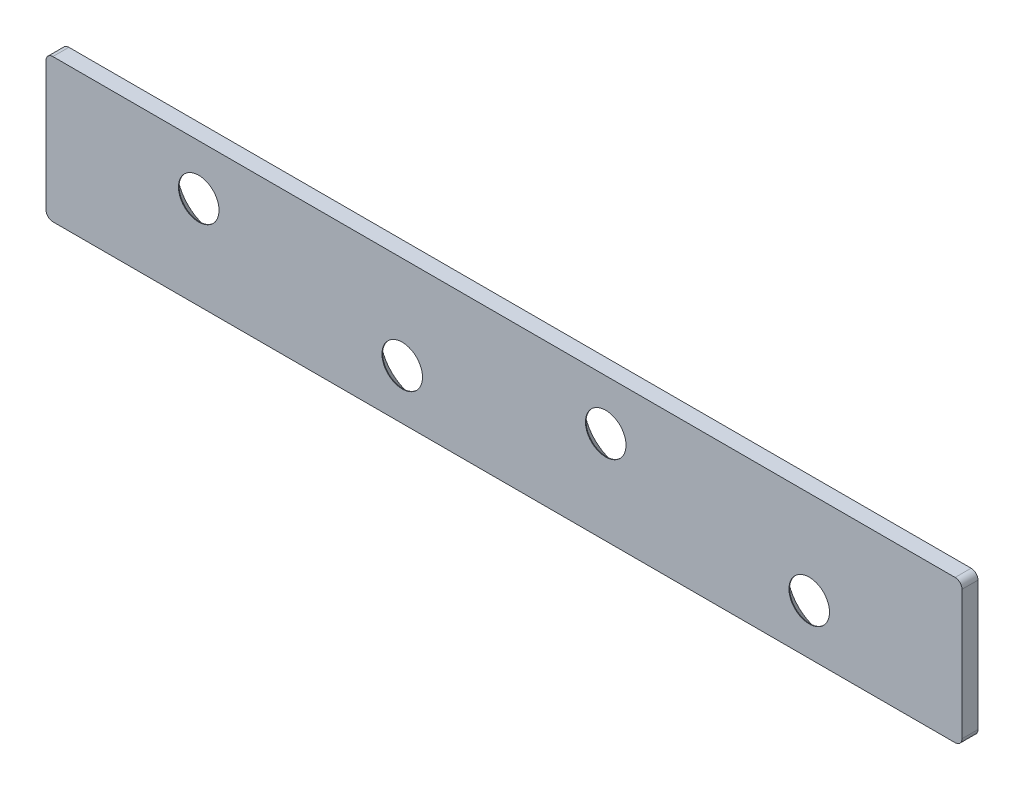
ISO-10303-21;
HEADER;
FILE_DESCRIPTION(('STEP AP214'),'2;1');
FILE_NAME('part.step','',(''),(''),'','','');
FILE_SCHEMA(('AUTOMOTIVE_DESIGN { 1 0 10303 214 1 1 1 1 }'));
ENDSEC;
DATA;
#1=APPLICATION_CONTEXT('core data for automotive mechanical design processes');
#2=APPLICATION_PROTOCOL_DEFINITION('international standard','automotive_design',2000,#1);
#3=PRODUCT_CONTEXT('',#1,'mechanical');
#4=PRODUCT('Part','Part','',(#3));
#5=PRODUCT_RELATED_PRODUCT_CATEGORY('part','',(#4));
#6=PRODUCT_DEFINITION_FORMATION('','',#4);
#7=PRODUCT_DEFINITION_CONTEXT('part definition',#1,'design');
#8=PRODUCT_DEFINITION('design','',#6,#7);
#9=PRODUCT_DEFINITION_SHAPE('','',#8);
#10=(LENGTH_UNIT() NAMED_UNIT(*) SI_UNIT(.MILLI.,.METRE.));
#11=(NAMED_UNIT(*) PLANE_ANGLE_UNIT() SI_UNIT($,.RADIAN.));
#12=(NAMED_UNIT(*) SI_UNIT($,.STERADIAN.) SOLID_ANGLE_UNIT());
#13=UNCERTAINTY_MEASURE_WITH_UNIT(LENGTH_MEASURE(1.E-05),#10,'distance_accuracy_value','');
#14=(GEOMETRIC_REPRESENTATION_CONTEXT(3) GLOBAL_UNCERTAINTY_ASSIGNED_CONTEXT((#13)) GLOBAL_UNIT_ASSIGNED_CONTEXT((#10,
#11,#12)) REPRESENTATION_CONTEXT('',''));
#15=CARTESIAN_POINT('',(0.,0.,0.));
#16=DIRECTION('',(0.,0.,1.));
#17=DIRECTION('',(1.,0.,0.));
#18=AXIS2_PLACEMENT_3D('',#15,#16,#17);
#19=CARTESIAN_POINT('',(11.2860666666667,2.37489999999977,-0.889));
#20=DIRECTION('',(0.,0.,1.));
#21=DIRECTION('',(1.,0.,0.));
#22=AXIS2_PLACEMENT_3D('',#19,#20,#21);
#23=CYLINDRICAL_SURFACE('',#22,2.2479);
#24=CARTESIAN_POINT('',(11.2860666666667,2.37489999999977,0.889));
#25=DIRECTION('',(0.,0.,1.));
#26=DIRECTION('',(1.,0.,0.));
#27=AXIS2_PLACEMENT_3D('',#24,#25,#26);
#28=CIRCLE('',#27,2.2479);
#29=CARTESIAN_POINT('',(13.5339666666667,2.37489999999977,0.889));
#30=VERTEX_POINT('',#29);
#31=EDGE_CURVE('E293',#30,#30,#28,.T.);
#32=ORIENTED_EDGE('',*,*,#31,.T.);
#33=EDGE_LOOP('',(#32));
#34=FACE_BOUND('',#33,.T.);
#35=CARTESIAN_POINT('',(11.2860666666667,2.37489999999977,0.822190943391239));
#36=DIRECTION('',(0.,0.,-1.));
#37=DIRECTION('',(-1.,0.,0.));
#38=AXIS2_PLACEMENT_3D('',#35,#36,#37);
#39=CIRCLE('',#38,2.2479);
#40=CARTESIAN_POINT('',(9.03816666666668,2.37489999999977,0.822190943391239));
#41=VERTEX_POINT('',#40);
#42=EDGE_CURVE('E256',#41,#41,#39,.F.);
#43=ORIENTED_EDGE('',*,*,#42,.F.);
#44=EDGE_LOOP('',(#43));
#45=FACE_BOUND('',#44,.T.);
#46=ADVANCED_FACE('F136',(#34,#45),#23,.F.);
#47=CARTESIAN_POINT('',(33.8582,-2.37490000000023,-0.889));
#48=DIRECTION('',(0.,0.,1.));
#49=DIRECTION('',(1.,0.,0.));
#50=AXIS2_PLACEMENT_3D('',#47,#48,#49);
#51=CYLINDRICAL_SURFACE('',#50,2.2479);
#52=CARTESIAN_POINT('',(33.8582,-2.37490000000023,0.889));
#53=DIRECTION('',(0.,0.,1.));
#54=DIRECTION('',(1.,0.,0.));
#55=AXIS2_PLACEMENT_3D('',#52,#53,#54);
#56=CIRCLE('',#55,2.2479);
#57=CARTESIAN_POINT('',(36.1061,-2.37490000000023,0.889));
#58=VERTEX_POINT('',#57);
#59=EDGE_CURVE('E294',#58,#58,#56,.T.);
#60=ORIENTED_EDGE('',*,*,#59,.T.);
#61=EDGE_LOOP('',(#60));
#62=FACE_BOUND('',#61,.T.);
#63=CARTESIAN_POINT('',(33.8582,-2.37490000000023,0.822190943391239));
#64=DIRECTION('',(0.,0.,-1.));
#65=DIRECTION('',(-1.,0.,0.));
#66=AXIS2_PLACEMENT_3D('',#63,#64,#65);
#67=CIRCLE('',#66,2.2479);
#68=CARTESIAN_POINT('',(31.6103,-2.37490000000023,0.822190943391239));
#69=VERTEX_POINT('',#68);
#70=EDGE_CURVE('E252',#69,#69,#67,.F.);
#71=ORIENTED_EDGE('',*,*,#70,.F.);
#72=EDGE_LOOP('',(#71));
#73=FACE_BOUND('',#72,.T.);
#74=ADVANCED_FACE('F323',(#62,#73),#51,.F.);
#75=CARTESIAN_POINT('',(-11.2860666666667,-2.37490000000023,-0.889));
#76=DIRECTION('',(0.,0.,1.));
#77=DIRECTION('',(1.,0.,0.));
#78=AXIS2_PLACEMENT_3D('',#75,#76,#77);
#79=CYLINDRICAL_SURFACE('',#78,2.2479);
#80=CARTESIAN_POINT('',(-11.2860666666667,-2.37490000000023,0.889));
#81=DIRECTION('',(0.,0.,1.));
#82=DIRECTION('',(1.,0.,0.));
#83=AXIS2_PLACEMENT_3D('',#80,#81,#82);
#84=CIRCLE('',#83,2.2479);
#85=CARTESIAN_POINT('',(-9.03816666666668,-2.37490000000023,0.889));
#86=VERTEX_POINT('',#85);
#87=EDGE_CURVE('E259',#86,#86,#84,.T.);
#88=ORIENTED_EDGE('',*,*,#87,.T.);
#89=EDGE_LOOP('',(#88));
#90=FACE_BOUND('',#89,.T.);
#91=CARTESIAN_POINT('',(-11.2860666666667,-2.37490000000022,0.822190943391239));
#92=DIRECTION('',(0.,0.,-1.));
#93=DIRECTION('',(-1.,0.,0.));
#94=AXIS2_PLACEMENT_3D('',#91,#92,#93);
#95=CIRCLE('',#94,2.2479);
#96=CARTESIAN_POINT('',(-13.5339666666667,-2.37490000000022,0.822190943391239));
#97=VERTEX_POINT('',#96);
#98=EDGE_CURVE('E249',#97,#97,#95,.F.);
#99=ORIENTED_EDGE('',*,*,#98,.F.);
#100=EDGE_LOOP('',(#99));
#101=FACE_BOUND('',#100,.T.);
#102=ADVANCED_FACE('F320',(#90,#101),#79,.F.);
#103=CARTESIAN_POINT('',(-33.8582,2.37489999999977,-0.889));
#104=DIRECTION('',(0.,0.,1.));
#105=DIRECTION('',(1.,0.,0.));
#106=AXIS2_PLACEMENT_3D('',#103,#104,#105);
#107=CYLINDRICAL_SURFACE('',#106,2.2479);
#108=CARTESIAN_POINT('',(-33.8582,2.37489999999977,0.889));
#109=DIRECTION('',(0.,0.,1.));
#110=DIRECTION('',(1.,0.,0.));
#111=AXIS2_PLACEMENT_3D('',#108,#109,#110);
#112=CIRCLE('',#111,2.2479);
#113=CARTESIAN_POINT('',(-31.6103,2.37489999999977,0.889));
#114=VERTEX_POINT('',#113);
#115=EDGE_CURVE('E247',#114,#114,#112,.T.);
#116=ORIENTED_EDGE('',*,*,#115,.T.);
#117=EDGE_LOOP('',(#116));
#118=FACE_BOUND('',#117,.T.);
#119=CARTESIAN_POINT('',(-33.8582,2.37489999999977,0.822190943391239));
#120=DIRECTION('',(0.,0.,-1.));
#121=DIRECTION('',(-1.,0.,0.));
#122=AXIS2_PLACEMENT_3D('',#119,#120,#121);
#123=CIRCLE('',#122,2.2479);
#124=CARTESIAN_POINT('',(-36.1061,2.37489999999977,0.822190943391239));
#125=VERTEX_POINT('',#124);
#126=EDGE_CURVE('E244',#125,#125,#123,.F.);
#127=ORIENTED_EDGE('',*,*,#126,.F.);
#128=EDGE_LOOP('',(#127));
#129=FACE_BOUND('',#128,.T.);
#130=ADVANCED_FACE('F322',(#118,#129),#107,.F.);
#131=CARTESIAN_POINT('',(-50.8,7.93749999999977,0.889));
#132=DIRECTION('',(1.,0.,0.));
#133=DIRECTION('',(0.,0.,-1.));
#134=AXIS2_PLACEMENT_3D('',#131,#132,#133);
#135=PLANE('',#134);
#136=DIRECTION('',(0.,-1.,0.));
#137=VECTOR('',#136,1.);
#138=CARTESIAN_POINT('',(-50.8,7.93749999999977,-0.889));
#139=LINE('',#138,#137);
#140=CARTESIAN_POINT('',(-50.8,7.17549999999977,-0.889));
#141=VERTEX_POINT('',#140);
#142=CARTESIAN_POINT('',(-50.8,-7.17550000000022,-0.889));
#143=VERTEX_POINT('',#142);
#144=EDGE_CURVE('E232',#141,#143,#139,.T.);
#145=ORIENTED_EDGE('',*,*,#144,.T.);
#146=DIRECTION('',(0.,0.,-1.));
#147=VECTOR('',#146,1.);
#148=CARTESIAN_POINT('',(-50.8,-7.17550000000022,0.889));
#149=LINE('',#148,#147);
#150=CARTESIAN_POINT('',(-50.8,-7.17550000000022,0.889));
#151=VERTEX_POINT('',#150);
#152=EDGE_CURVE('E12',#143,#151,#149,.F.);
#153=ORIENTED_EDGE('',*,*,#152,.T.);
#154=DIRECTION('',(0.,-1.,0.));
#155=VECTOR('',#154,1.);
#156=CARTESIAN_POINT('',(-50.8,7.93749999999977,0.889));
#157=LINE('',#156,#155);
#158=CARTESIAN_POINT('',(-50.8,7.17549999999977,0.889));
#159=VERTEX_POINT('',#158);
#160=EDGE_CURVE('E230',#159,#151,#157,.T.);
#161=ORIENTED_EDGE('',*,*,#160,.F.);
#162=DIRECTION('',(0.,0.,-1.));
#163=VECTOR('',#162,1.);
#164=CARTESIAN_POINT('',(-50.8,7.17549999999977,0.889));
#165=LINE('',#164,#163);
#166=EDGE_CURVE('E144',#159,#141,#165,.T.);
#167=ORIENTED_EDGE('',*,*,#166,.T.);
#168=EDGE_LOOP('',(#145,#153,#161,#167));
#169=FACE_BOUND('',#168,.T.);
#170=ADVANCED_FACE('F284',(#169),#135,.F.);
#171=CARTESIAN_POINT('',(-50.8,-7.93750000000022,0.889));
#172=DIRECTION('',(0.,1.,0.));
#173=DIRECTION('',(0.,0.,1.));
#174=AXIS2_PLACEMENT_3D('',#171,#172,#173);
#175=PLANE('',#174);
#176=DIRECTION('',(1.,0.,0.));
#177=VECTOR('',#176,1.);
#178=CARTESIAN_POINT('',(-50.8,-7.93750000000022,-0.889));
#179=LINE('',#178,#177);
#180=CARTESIAN_POINT('',(-50.038,-7.93750000000022,-0.889));
#181=VERTEX_POINT('',#180);
#182=CARTESIAN_POINT('',(50.038,-7.93750000000022,-0.889));
#183=VERTEX_POINT('',#182);
#184=EDGE_CURVE('E228',#181,#183,#179,.T.);
#185=ORIENTED_EDGE('',*,*,#184,.T.);
#186=DIRECTION('',(0.,0.,-1.));
#187=VECTOR('',#186,1.);
#188=CARTESIAN_POINT('',(50.038,-7.93750000000022,0.889));
#189=LINE('',#188,#187);
#190=CARTESIAN_POINT('',(50.038,-7.93750000000022,0.889));
#191=VERTEX_POINT('',#190);
#192=EDGE_CURVE('E207',#183,#191,#189,.F.);
#193=ORIENTED_EDGE('',*,*,#192,.T.);
#194=DIRECTION('',(1.,0.,0.));
#195=VECTOR('',#194,1.);
#196=CARTESIAN_POINT('',(-50.8,-7.93750000000022,0.889));
#197=LINE('',#196,#195);
#198=CARTESIAN_POINT('',(-50.038,-7.93750000000022,0.889));
#199=VERTEX_POINT('',#198);
#200=EDGE_CURVE('E238',#199,#191,#197,.T.);
#201=ORIENTED_EDGE('',*,*,#200,.F.);
#202=DIRECTION('',(0.,0.,-1.));
#203=VECTOR('',#202,1.);
#204=CARTESIAN_POINT('',(-50.038,-7.93750000000022,0.889));
#205=LINE('',#204,#203);
#206=EDGE_CURVE('E212',#199,#181,#205,.T.);
#207=ORIENTED_EDGE('',*,*,#206,.T.);
#208=EDGE_LOOP('',(#185,#193,#201,#207));
#209=FACE_BOUND('',#208,.T.);
#210=ADVANCED_FACE('F356',(#209),#175,.F.);
#211=CARTESIAN_POINT('',(50.8,7.93749999999977,0.889));
#212=DIRECTION('',(-1.,0.,0.));
#213=DIRECTION('',(0.,0.,1.));
#214=AXIS2_PLACEMENT_3D('',#211,#212,#213);
#215=PLANE('',#214);
#216=DIRECTION('',(0.,1.,0.));
#217=VECTOR('',#216,1.);
#218=CARTESIAN_POINT('',(50.8,7.93749999999977,0.889));
#219=LINE('',#218,#217);
#220=CARTESIAN_POINT('',(50.8,-7.17550000000022,0.889));
#221=VERTEX_POINT('',#220);
#222=CARTESIAN_POINT('',(50.8,7.17549999999977,0.889));
#223=VERTEX_POINT('',#222);
#224=EDGE_CURVE('E221',#221,#223,#219,.T.);
#225=ORIENTED_EDGE('',*,*,#224,.F.);
#226=DIRECTION('',(0.,0.,-1.));
#227=VECTOR('',#226,1.);
#228=CARTESIAN_POINT('',(50.8,-7.17550000000022,0.889));
#229=LINE('',#228,#227);
#230=CARTESIAN_POINT('',(50.8,-7.17550000000022,-0.889));
#231=VERTEX_POINT('',#230);
#232=EDGE_CURVE('E206',#221,#231,#229,.T.);
#233=ORIENTED_EDGE('',*,*,#232,.T.);
#234=DIRECTION('',(0.,1.,0.));
#235=VECTOR('',#234,1.);
#236=CARTESIAN_POINT('',(50.8,7.93749999999977,-0.889));
#237=LINE('',#236,#235);
#238=CARTESIAN_POINT('',(50.8,7.17549999999977,-0.889));
#239=VERTEX_POINT('',#238);
#240=EDGE_CURVE('E219',#231,#239,#237,.T.);
#241=ORIENTED_EDGE('',*,*,#240,.T.);
#242=DIRECTION('',(0.,0.,-1.));
#243=VECTOR('',#242,1.);
#244=CARTESIAN_POINT('',(50.8,7.17549999999977,0.889));
#245=LINE('',#244,#243);
#246=EDGE_CURVE('E223',#239,#223,#245,.F.);
#247=ORIENTED_EDGE('',*,*,#246,.T.);
#248=EDGE_LOOP('',(#225,#233,#241,#247));
#249=FACE_BOUND('',#248,.T.);
#250=ADVANCED_FACE('F218',(#249),#215,.F.);
#251=CARTESIAN_POINT('',(-50.8,7.93749999999977,0.889));
#252=DIRECTION('',(0.,-1.,0.));
#253=DIRECTION('',(0.,0.,-1.));
#254=AXIS2_PLACEMENT_3D('',#251,#252,#253);
#255=PLANE('',#254);
#256=DIRECTION('',(-1.,0.,0.));
#257=VECTOR('',#256,1.);
#258=CARTESIAN_POINT('',(-50.8,7.93749999999977,0.889));
#259=LINE('',#258,#257);
#260=CARTESIAN_POINT('',(50.038,7.93749999999977,0.889));
#261=VERTEX_POINT('',#260);
#262=CARTESIAN_POINT('',(-50.038,7.93749999999977,0.889));
#263=VERTEX_POINT('',#262);
#264=EDGE_CURVE('E242',#261,#263,#259,.T.);
#265=ORIENTED_EDGE('',*,*,#264,.F.);
#266=DIRECTION('',(0.,0.,-1.));
#267=VECTOR('',#266,1.);
#268=CARTESIAN_POINT('',(50.038,7.93749999999977,0.889));
#269=LINE('',#268,#267);
#270=CARTESIAN_POINT('',(50.038,7.93749999999977,-0.889));
#271=VERTEX_POINT('',#270);
#272=EDGE_CURVE('E276',#261,#271,#269,.T.);
#273=ORIENTED_EDGE('',*,*,#272,.T.);
#274=DIRECTION('',(-1.,0.,0.));
#275=VECTOR('',#274,1.);
#276=CARTESIAN_POINT('',(-50.8,7.93749999999977,-0.889));
#277=LINE('',#276,#275);
#278=CARTESIAN_POINT('',(-50.038,7.93749999999977,-0.889));
#279=VERTEX_POINT('',#278);
#280=EDGE_CURVE('E227',#271,#279,#277,.T.);
#281=ORIENTED_EDGE('',*,*,#280,.T.);
#282=DIRECTION('',(0.,0.,-1.));
#283=VECTOR('',#282,1.);
#284=CARTESIAN_POINT('',(-50.038,7.93749999999977,0.889));
#285=LINE('',#284,#283);
#286=EDGE_CURVE('E151',#279,#263,#285,.F.);
#287=ORIENTED_EDGE('',*,*,#286,.T.);
#288=EDGE_LOOP('',(#265,#273,#281,#287));
#289=FACE_BOUND('',#288,.T.);
#290=ADVANCED_FACE('F350',(#289),#255,.F.);
#291=CARTESIAN_POINT('',(0.,0.,0.889));
#292=DIRECTION('',(0.,0.,1.));
#293=DIRECTION('',(1.,0.,0.));
#294=AXIS2_PLACEMENT_3D('',#291,#292,#293);
#295=PLANE('',#294);
#296=ORIENTED_EDGE('',*,*,#87,.F.);
#297=EDGE_LOOP('',(#296));
#298=FACE_BOUND('',#297,.T.);
#299=ORIENTED_EDGE('',*,*,#59,.F.);
#300=EDGE_LOOP('',(#299));
#301=FACE_BOUND('',#300,.T.);
#302=ORIENTED_EDGE('',*,*,#31,.F.);
#303=EDGE_LOOP('',(#302));
#304=FACE_BOUND('',#303,.T.);
#305=ORIENTED_EDGE('',*,*,#115,.F.);
#306=EDGE_LOOP('',(#305));
#307=FACE_BOUND('',#306,.T.);
#308=ORIENTED_EDGE('',*,*,#200,.T.);
#309=CARTESIAN_POINT('',(50.038,-7.17550000000022,0.889));
#310=DIRECTION('',(0.,0.,1.));
#311=DIRECTION('',(1.,0.,0.));
#312=AXIS2_PLACEMENT_3D('',#309,#310,#311);
#313=CIRCLE('',#312,0.762);
#314=EDGE_CURVE('E273',#191,#221,#313,.T.);
#315=ORIENTED_EDGE('',*,*,#314,.T.);
#316=ORIENTED_EDGE('',*,*,#224,.T.);
#317=CARTESIAN_POINT('',(50.038,7.17549999999977,0.889));
#318=DIRECTION('',(0.,0.,1.));
#319=DIRECTION('',(1.,0.,0.));
#320=AXIS2_PLACEMENT_3D('',#317,#318,#319);
#321=CIRCLE('',#320,0.762);
#322=EDGE_CURVE('E158',#223,#261,#321,.T.);
#323=ORIENTED_EDGE('',*,*,#322,.T.);
#324=ORIENTED_EDGE('',*,*,#264,.T.);
#325=CARTESIAN_POINT('',(-50.038,7.17549999999977,0.889));
#326=DIRECTION('',(0.,0.,1.));
#327=DIRECTION('',(1.,0.,0.));
#328=AXIS2_PLACEMENT_3D('',#325,#326,#327);
#329=CIRCLE('',#328,0.762);
#330=EDGE_CURVE('E268',#263,#159,#329,.T.);
#331=ORIENTED_EDGE('',*,*,#330,.T.);
#332=ORIENTED_EDGE('',*,*,#160,.T.);
#333=CARTESIAN_POINT('',(-50.038,-7.17550000000022,0.889));
#334=DIRECTION('',(0.,0.,1.));
#335=DIRECTION('',(1.,0.,0.));
#336=AXIS2_PLACEMENT_3D('',#333,#334,#335);
#337=CIRCLE('',#336,0.762);
#338=EDGE_CURVE('E270',#151,#199,#337,.T.);
#339=ORIENTED_EDGE('',*,*,#338,.T.);
#340=EDGE_LOOP('',(#308,#315,#316,#323,#324,#331,#332,#339));
#341=FACE_BOUND('',#340,.T.);
#342=ADVANCED_FACE('F347',(#298,#301,#304,#307,#341),#295,.T.);
#343=CARTESIAN_POINT('',(0.,0.,-0.889));
#344=DIRECTION('',(0.,0.,1.));
#345=DIRECTION('',(1.,0.,0.));
#346=AXIS2_PLACEMENT_3D('',#343,#344,#345);
#347=PLANE('',#346);
#348=CARTESIAN_POINT('',(-11.2860666666667,-2.37490000000022,-0.889));
#349=DIRECTION('',(0.,0.,1.));
#350=DIRECTION('',(1.,0.,0.));
#351=AXIS2_PLACEMENT_3D('',#348,#349,#350);
#352=CIRCLE('',#351,4.2164);
#353=CARTESIAN_POINT('',(-7.06966666666667,-2.37490000000022,-0.889));
#354=VERTEX_POINT('',#353);
#355=EDGE_CURVE('E304',#354,#354,#352,.T.);
#356=ORIENTED_EDGE('',*,*,#355,.T.);
#357=EDGE_LOOP('',(#356));
#358=FACE_BOUND('',#357,.T.);
#359=CARTESIAN_POINT('',(33.8582,-2.37490000000023,-0.889));
#360=DIRECTION('',(0.,0.,1.));
#361=DIRECTION('',(1.,0.,0.));
#362=AXIS2_PLACEMENT_3D('',#359,#360,#361);
#363=CIRCLE('',#362,4.2164);
#364=CARTESIAN_POINT('',(38.0746,-2.37490000000023,-0.889));
#365=VERTEX_POINT('',#364);
#366=EDGE_CURVE('E301',#365,#365,#363,.T.);
#367=ORIENTED_EDGE('',*,*,#366,.T.);
#368=EDGE_LOOP('',(#367));
#369=FACE_BOUND('',#368,.T.);
#370=CARTESIAN_POINT('',(11.2860666666667,2.37489999999977,-0.889));
#371=DIRECTION('',(0.,0.,1.));
#372=DIRECTION('',(1.,0.,0.));
#373=AXIS2_PLACEMENT_3D('',#370,#371,#372);
#374=CIRCLE('',#373,4.2164);
#375=CARTESIAN_POINT('',(15.5024666666667,2.37489999999977,-0.889));
#376=VERTEX_POINT('',#375);
#377=EDGE_CURVE('E253',#376,#376,#374,.T.);
#378=ORIENTED_EDGE('',*,*,#377,.T.);
#379=EDGE_LOOP('',(#378));
#380=FACE_BOUND('',#379,.T.);
#381=CARTESIAN_POINT('',(-33.8582,2.37489999999977,-0.889));
#382=DIRECTION('',(0.,0.,1.));
#383=DIRECTION('',(1.,0.,0.));
#384=AXIS2_PLACEMENT_3D('',#381,#382,#383);
#385=CIRCLE('',#384,4.2164);
#386=CARTESIAN_POINT('',(-29.6418,2.37489999999977,-0.889));
#387=VERTEX_POINT('',#386);
#388=EDGE_CURVE('E248',#387,#387,#385,.T.);
#389=ORIENTED_EDGE('',*,*,#388,.T.);
#390=EDGE_LOOP('',(#389));
#391=FACE_BOUND('',#390,.T.);
#392=ORIENTED_EDGE('',*,*,#240,.F.);
#393=CARTESIAN_POINT('',(50.038,-7.17550000000022,-0.889));
#394=DIRECTION('',(0.,0.,1.));
#395=DIRECTION('',(1.,0.,0.));
#396=AXIS2_PLACEMENT_3D('',#393,#394,#395);
#397=CIRCLE('',#396,0.762);
#398=EDGE_CURVE('E202',#231,#183,#397,.F.);
#399=ORIENTED_EDGE('',*,*,#398,.T.);
#400=ORIENTED_EDGE('',*,*,#184,.F.);
#401=CARTESIAN_POINT('',(-50.038,-7.17550000000022,-0.889));
#402=DIRECTION('',(0.,0.,1.));
#403=DIRECTION('',(1.,0.,0.));
#404=AXIS2_PLACEMENT_3D('',#401,#402,#403);
#405=CIRCLE('',#404,0.762);
#406=EDGE_CURVE('E262',#181,#143,#405,.F.);
#407=ORIENTED_EDGE('',*,*,#406,.T.);
#408=ORIENTED_EDGE('',*,*,#144,.F.);
#409=CARTESIAN_POINT('',(-50.038,7.17549999999977,-0.889));
#410=DIRECTION('',(0.,0.,1.));
#411=DIRECTION('',(1.,0.,0.));
#412=AXIS2_PLACEMENT_3D('',#409,#410,#411);
#413=CIRCLE('',#412,0.762);
#414=EDGE_CURVE('E222',#141,#279,#413,.F.);
#415=ORIENTED_EDGE('',*,*,#414,.T.);
#416=ORIENTED_EDGE('',*,*,#280,.F.);
#417=CARTESIAN_POINT('',(50.038,7.17549999999977,-0.889));
#418=DIRECTION('',(0.,0.,1.));
#419=DIRECTION('',(1.,0.,0.));
#420=AXIS2_PLACEMENT_3D('',#417,#418,#419);
#421=CIRCLE('',#420,0.762);
#422=EDGE_CURVE('E213',#271,#239,#421,.F.);
#423=ORIENTED_EDGE('',*,*,#422,.T.);
#424=EDGE_LOOP('',(#392,#399,#400,#407,#408,#415,#416,#423));
#425=FACE_BOUND('',#424,.T.);
#426=ADVANCED_FACE('F225',(#358,#369,#380,#391,#425),#347,.F.);
#427=CARTESIAN_POINT('',(-33.8582,2.37489999999977,-0.889));
#428=DIRECTION('',(0.,0.,-1.));
#429=DIRECTION('',(1.,0.,0.));
#430=AXIS2_PLACEMENT_3D('',#427,#428,#429);
#431=CONICAL_SURFACE('',#430,4.2164,0.855211333477223);
#432=ORIENTED_EDGE('',*,*,#388,.F.);
#433=EDGE_LOOP('',(#432));
#434=FACE_BOUND('',#433,.T.);
#435=ORIENTED_EDGE('',*,*,#126,.T.);
#436=EDGE_LOOP('',(#435));
#437=FACE_BOUND('',#436,.T.);
#438=ADVANCED_FACE('F316',(#434,#437),#431,.F.);
#439=CARTESIAN_POINT('',(-11.2860666666667,-2.37490000000022,-0.889));
#440=DIRECTION('',(0.,0.,-1.));
#441=DIRECTION('',(1.,0.,0.));
#442=AXIS2_PLACEMENT_3D('',#439,#440,#441);
#443=CONICAL_SURFACE('',#442,4.2164,0.855211333477223);
#444=ORIENTED_EDGE('',*,*,#355,.F.);
#445=EDGE_LOOP('',(#444));
#446=FACE_BOUND('',#445,.T.);
#447=ORIENTED_EDGE('',*,*,#98,.T.);
#448=EDGE_LOOP('',(#447));
#449=FACE_BOUND('',#448,.T.);
#450=ADVANCED_FACE('F312',(#446,#449),#443,.F.);
#451=CARTESIAN_POINT('',(33.8582,-2.37490000000023,-0.889));
#452=DIRECTION('',(0.,0.,-1.));
#453=DIRECTION('',(1.,0.,0.));
#454=AXIS2_PLACEMENT_3D('',#451,#452,#453);
#455=CONICAL_SURFACE('',#454,4.2164,0.855211333477223);
#456=ORIENTED_EDGE('',*,*,#366,.F.);
#457=EDGE_LOOP('',(#456));
#458=FACE_BOUND('',#457,.T.);
#459=ORIENTED_EDGE('',*,*,#70,.T.);
#460=EDGE_LOOP('',(#459));
#461=FACE_BOUND('',#460,.T.);
#462=ADVANCED_FACE('F315',(#458,#461),#455,.F.);
#463=CARTESIAN_POINT('',(11.2860666666667,2.37489999999977,-0.889));
#464=DIRECTION('',(0.,0.,-1.));
#465=DIRECTION('',(1.,0.,0.));
#466=AXIS2_PLACEMENT_3D('',#463,#464,#465);
#467=CONICAL_SURFACE('',#466,4.2164,0.855211333477223);
#468=ORIENTED_EDGE('',*,*,#377,.F.);
#469=EDGE_LOOP('',(#468));
#470=FACE_BOUND('',#469,.T.);
#471=ORIENTED_EDGE('',*,*,#42,.T.);
#472=EDGE_LOOP('',(#471));
#473=FACE_BOUND('',#472,.T.);
#474=ADVANCED_FACE('F365',(#470,#473),#467,.F.);
#475=CARTESIAN_POINT('',(50.038,-7.17550000000022,0.889));
#476=DIRECTION('',(0.,0.,-1.));
#477=DIRECTION('',(-1.,0.,0.));
#478=AXIS2_PLACEMENT_3D('',#475,#476,#477);
#479=CYLINDRICAL_SURFACE('',#478,0.762);
#480=ORIENTED_EDGE('',*,*,#314,.F.);
#481=ORIENTED_EDGE('',*,*,#192,.F.);
#482=ORIENTED_EDGE('',*,*,#398,.F.);
#483=ORIENTED_EDGE('',*,*,#232,.F.);
#484=EDGE_LOOP('',(#480,#481,#482,#483));
#485=FACE_BOUND('',#484,.T.);
#486=ADVANCED_FACE('F205',(#485),#479,.T.);
#487=CARTESIAN_POINT('',(50.038,7.17549999999977,0.889));
#488=DIRECTION('',(0.,0.,-1.));
#489=DIRECTION('',(-1.,0.,0.));
#490=AXIS2_PLACEMENT_3D('',#487,#488,#489);
#491=CYLINDRICAL_SURFACE('',#490,0.762);
#492=ORIENTED_EDGE('',*,*,#322,.F.);
#493=ORIENTED_EDGE('',*,*,#246,.F.);
#494=ORIENTED_EDGE('',*,*,#422,.F.);
#495=ORIENTED_EDGE('',*,*,#272,.F.);
#496=EDGE_LOOP('',(#492,#493,#494,#495));
#497=FACE_BOUND('',#496,.T.);
#498=ADVANCED_FACE('F364',(#497),#491,.T.);
#499=CARTESIAN_POINT('',(-50.038,-7.17550000000022,0.889));
#500=DIRECTION('',(0.,0.,-1.));
#501=DIRECTION('',(-1.,0.,0.));
#502=AXIS2_PLACEMENT_3D('',#499,#500,#501);
#503=CYLINDRICAL_SURFACE('',#502,0.762);
#504=ORIENTED_EDGE('',*,*,#338,.F.);
#505=ORIENTED_EDGE('',*,*,#152,.F.);
#506=ORIENTED_EDGE('',*,*,#406,.F.);
#507=ORIENTED_EDGE('',*,*,#206,.F.);
#508=EDGE_LOOP('',(#504,#505,#506,#507));
#509=FACE_BOUND('',#508,.T.);
#510=ADVANCED_FACE('F367',(#509),#503,.T.);
#511=CARTESIAN_POINT('',(-50.038,7.17549999999977,0.889));
#512=DIRECTION('',(0.,0.,-1.));
#513=DIRECTION('',(-1.,0.,0.));
#514=AXIS2_PLACEMENT_3D('',#511,#512,#513);
#515=CYLINDRICAL_SURFACE('',#514,0.762);
#516=ORIENTED_EDGE('',*,*,#330,.F.);
#517=ORIENTED_EDGE('',*,*,#286,.F.);
#518=ORIENTED_EDGE('',*,*,#414,.F.);
#519=ORIENTED_EDGE('',*,*,#166,.F.);
#520=EDGE_LOOP('',(#516,#517,#518,#519));
#521=FACE_BOUND('',#520,.T.);
#522=ADVANCED_FACE('F138',(#521),#515,.T.);
#523=CLOSED_SHELL('',(#46,#74,#102,#130,#170,#210,#250,#290,#342,#426,#438,#450,#462,#474,#486,
#498,#510,#522));
#524=MANIFOLD_SOLID_BREP('B2',#523);
#525=ADVANCED_BREP_SHAPE_REPRESENTATION('',(#18,#524),#14);
#526=SHAPE_DEFINITION_REPRESENTATION(#9,#525);
ENDSEC;
END-ISO-10303-21;
